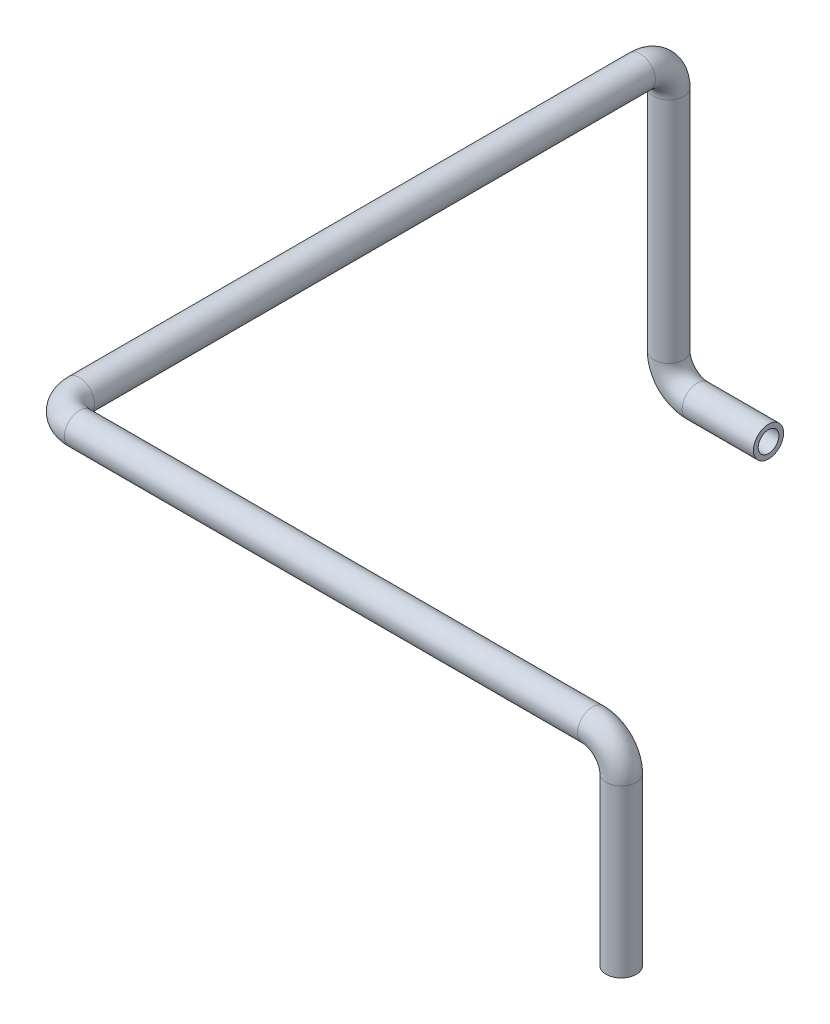
ISO-10303-21;
HEADER;
FILE_DESCRIPTION(('STEP AP214'),'2;1');
FILE_NAME('part.step','',(''),(''),'','','');
FILE_SCHEMA(('AUTOMOTIVE_DESIGN { 1 0 10303 214 1 1 1 1 }'));
ENDSEC;
DATA;
#1=APPLICATION_CONTEXT('core data for automotive mechanical design processes');
#2=APPLICATION_PROTOCOL_DEFINITION('international standard','automotive_design',2000,#1);
#3=PRODUCT_CONTEXT('',#1,'mechanical');
#4=PRODUCT('Part','Part','',(#3));
#5=PRODUCT_RELATED_PRODUCT_CATEGORY('part','',(#4));
#6=PRODUCT_DEFINITION_FORMATION('','',#4);
#7=PRODUCT_DEFINITION_CONTEXT('part definition',#1,'design');
#8=PRODUCT_DEFINITION('design','',#6,#7);
#9=PRODUCT_DEFINITION_SHAPE('','',#8);
#10=(LENGTH_UNIT() NAMED_UNIT(*) SI_UNIT(.MILLI.,.METRE.));
#11=(NAMED_UNIT(*) PLANE_ANGLE_UNIT() SI_UNIT($,.RADIAN.));
#12=(NAMED_UNIT(*) SI_UNIT($,.STERADIAN.) SOLID_ANGLE_UNIT());
#13=UNCERTAINTY_MEASURE_WITH_UNIT(LENGTH_MEASURE(1.E-05),#10,'distance_accuracy_value','');
#14=(GEOMETRIC_REPRESENTATION_CONTEXT(3) GLOBAL_UNCERTAINTY_ASSIGNED_CONTEXT((#13)) GLOBAL_UNIT_ASSIGNED_CONTEXT((#10,
#11,#12)) REPRESENTATION_CONTEXT('',''));
#15=CARTESIAN_POINT('',(0.,0.,0.));
#16=DIRECTION('',(0.,0.,1.));
#17=DIRECTION('',(1.,0.,0.));
#18=AXIS2_PLACEMENT_3D('',#15,#16,#17);
#19=CARTESIAN_POINT('',(-149.,290.,50.));
#20=DIRECTION('',(1.,0.,0.));
#21=DIRECTION('',(0.,-1.,0.));
#22=AXIS2_PLACEMENT_3D('',#19,#20,#21);
#23=PLANE('',#22);
#24=CARTESIAN_POINT('',(-149.,290.,50.));
#25=DIRECTION('',(1.,0.,0.));
#26=DIRECTION('',(0.,-1.,0.));
#27=AXIS2_PLACEMENT_3D('',#24,#25,#26);
#28=CIRCLE('',#27,2.175);
#29=CARTESIAN_POINT('',(-149.,287.825,50.));
#30=VERTEX_POINT('',#29);
#31=EDGE_CURVE('E311',#30,#30,#28,.T.);
#32=ORIENTED_EDGE('',*,*,#31,.F.);
#33=EDGE_LOOP('',(#32));
#34=FACE_BOUND('',#33,.T.);
#35=CARTESIAN_POINT('',(-149.,290.,50.));
#36=DIRECTION('',(1.,0.,0.));
#37=DIRECTION('',(0.,0.,-1.));
#38=AXIS2_PLACEMENT_3D('',#35,#36,#37);
#39=CIRCLE('',#38,3.175);
#40=CARTESIAN_POINT('',(-149.,290.,46.825));
#41=VERTEX_POINT('',#40);
#42=EDGE_CURVE('E75',#41,#41,#39,.T.);
#43=ORIENTED_EDGE('',*,*,#42,.T.);
#44=EDGE_LOOP('',(#43));
#45=FACE_BOUND('',#44,.T.);
#46=ADVANCED_FACE('F52',(#34,#45),#23,.T.);
#47=CARTESIAN_POINT('',(-50.,309.,180.));
#48=DIRECTION('',(0.,1.,0.));
#49=DIRECTION('',(0.,0.,1.));
#50=AXIS2_PLACEMENT_3D('',#47,#48,#49);
#51=PLANE('',#50);
#52=CARTESIAN_POINT('',(-50.,309.,180.));
#53=DIRECTION('',(0.,1.,0.));
#54=DIRECTION('',(0.,0.,1.));
#55=AXIS2_PLACEMENT_3D('',#52,#53,#54);
#56=CIRCLE('',#55,2.175);
#57=CARTESIAN_POINT('',(-50.,309.,182.175));
#58=VERTEX_POINT('',#57);
#59=EDGE_CURVE('E73',#58,#58,#56,.T.);
#60=ORIENTED_EDGE('',*,*,#59,.T.);
#61=EDGE_LOOP('',(#60));
#62=FACE_BOUND('',#61,.T.);
#63=CARTESIAN_POINT('',(-50.,309.,180.));
#64=DIRECTION('',(0.,1.,0.));
#65=DIRECTION('',(0.,0.,1.));
#66=AXIS2_PLACEMENT_3D('',#63,#64,#65);
#67=CIRCLE('',#66,3.175);
#68=CARTESIAN_POINT('',(-50.,309.,183.175));
#69=VERTEX_POINT('',#68);
#70=EDGE_CURVE('E11',#69,#69,#67,.T.);
#71=ORIENTED_EDGE('',*,*,#70,.F.);
#72=EDGE_LOOP('',(#71));
#73=FACE_BOUND('',#72,.T.);
#74=ADVANCED_FACE('F162',(#62,#73),#51,.F.);
#75=CARTESIAN_POINT('',(-149.,290.,50.));
#76=DIRECTION('',(-1.,0.,0.));
#77=DIRECTION('',(0.,0.,1.));
#78=AXIS2_PLACEMENT_3D('',#75,#76,#77);
#79=CYLINDRICAL_SURFACE('',#78,3.175);
#80=CARTESIAN_POINT('',(-164.,290.,50.));
#81=DIRECTION('',(-1.,0.,0.));
#82=DIRECTION('',(0.,0.,1.));
#83=AXIS2_PLACEMENT_3D('',#80,#81,#82);
#84=CIRCLE('',#83,3.175);
#85=CARTESIAN_POINT('',(-164.,286.825,50.));
#86=VERTEX_POINT('',#85);
#87=EDGE_CURVE('E74',#86,#86,#84,.F.);
#88=ORIENTED_EDGE('',*,*,#87,.T.);
#89=EDGE_LOOP('',(#88));
#90=FACE_BOUND('',#89,.T.);
#91=ORIENTED_EDGE('',*,*,#42,.F.);
#92=EDGE_LOOP('',(#91));
#93=FACE_BOUND('',#92,.T.);
#94=ADVANCED_FACE('F167',(#90,#93),#79,.T.);
#95=CARTESIAN_POINT('',(-164.,296.,50.));
#96=DIRECTION('',(0.,0.,-1.));
#97=DIRECTION('',(-1.,0.,0.));
#98=AXIS2_PLACEMENT_3D('',#95,#96,#97);
#99=TOROIDAL_SURFACE('',#98,5.99999999999995,3.175);
#100=CARTESIAN_POINT('',(-170.,296.,50.));
#101=DIRECTION('',(0.,-1.,0.));
#102=DIRECTION('',(1.,0.,0.));
#103=AXIS2_PLACEMENT_3D('',#100,#101,#102);
#104=CIRCLE('',#103,3.175);
#105=CARTESIAN_POINT('',(-173.175,296.,50.));
#106=VERTEX_POINT('',#105);
#107=EDGE_CURVE('E78',#106,#106,#104,.T.);
#108=CARTESIAN_POINT('',(-164.,296.,50.));
#109=DIRECTION('',(0.,0.,-1.));
#110=DIRECTION('',(-1.,0.,0.));
#111=AXIS2_PLACEMENT_3D('',#108,#109,#110);
#112=CIRCLE('',#111,9.17499999999995);
#113=EDGE_CURVE('',#86,#106,#112,.T.);
#114=ORIENTED_EDGE('',*,*,#87,.F.);
#115=ORIENTED_EDGE('',*,*,#107,.T.);
#116=ORIENTED_EDGE('',*,*,#113,.T.);
#117=ORIENTED_EDGE('',*,*,#113,.F.);
#118=EDGE_LOOP('',(#114,#116,#115,#117));
#119=FACE_BOUND('',#118,.T.);
#120=ADVANCED_FACE('F171',(#119),#99,.T.);
#121=CARTESIAN_POINT('',(-170.,296.,50.));
#122=DIRECTION('',(0.,1.,0.));
#123=DIRECTION('',(0.,0.,1.));
#124=AXIS2_PLACEMENT_3D('',#121,#122,#123);
#125=CYLINDRICAL_SURFACE('',#124,3.175);
#126=CARTESIAN_POINT('',(-170.,344.,50.));
#127=DIRECTION('',(0.,1.,0.));
#128=DIRECTION('',(0.,0.,1.));
#129=AXIS2_PLACEMENT_3D('',#126,#127,#128);
#130=CIRCLE('',#129,3.175);
#131=CARTESIAN_POINT('',(-170.,344.,46.825));
#132=VERTEX_POINT('',#131);
#133=EDGE_CURVE('E91',#132,#132,#130,.F.);
#134=ORIENTED_EDGE('',*,*,#133,.T.);
#135=EDGE_LOOP('',(#134));
#136=FACE_BOUND('',#135,.T.);
#137=ORIENTED_EDGE('',*,*,#107,.F.);
#138=EDGE_LOOP('',(#137));
#139=FACE_BOUND('',#138,.T.);
#140=ADVANCED_FACE('F176',(#136,#139),#125,.T.);
#141=CARTESIAN_POINT('',(-170.,344.,56.));
#142=DIRECTION('',(1.,0.,0.));
#143=DIRECTION('',(0.,0.,-1.));
#144=AXIS2_PLACEMENT_3D('',#141,#142,#143);
#145=TOROIDAL_SURFACE('',#144,6.,3.175);
#146=CARTESIAN_POINT('',(-170.,350.,56.));
#147=DIRECTION('',(0.,0.,-1.));
#148=DIRECTION('',(0.,1.,0.));
#149=AXIS2_PLACEMENT_3D('',#146,#147,#148);
#150=CIRCLE('',#149,3.175);
#151=CARTESIAN_POINT('',(-170.,353.175,56.));
#152=VERTEX_POINT('',#151);
#153=EDGE_CURVE('E96',#152,#152,#150,.T.);
#154=CARTESIAN_POINT('',(-170.,344.,56.));
#155=DIRECTION('',(1.,0.,0.));
#156=DIRECTION('',(0.,0.,-1.));
#157=AXIS2_PLACEMENT_3D('',#154,#155,#156);
#158=CIRCLE('',#157,9.175);
#159=EDGE_CURVE('',#132,#152,#158,.T.);
#160=ORIENTED_EDGE('',*,*,#133,.F.);
#161=ORIENTED_EDGE('',*,*,#153,.T.);
#162=ORIENTED_EDGE('',*,*,#159,.T.);
#163=ORIENTED_EDGE('',*,*,#159,.F.);
#164=EDGE_LOOP('',(#160,#162,#161,#163));
#165=FACE_BOUND('',#164,.T.);
#166=ADVANCED_FACE('F179',(#165),#145,.T.);
#167=CARTESIAN_POINT('',(-170.,350.,56.));
#168=DIRECTION('',(0.,0.,1.));
#169=DIRECTION('',(1.,0.,0.));
#170=AXIS2_PLACEMENT_3D('',#167,#168,#169);
#171=CYLINDRICAL_SURFACE('',#170,3.175);
#172=CARTESIAN_POINT('',(-170.,350.,174.));
#173=DIRECTION('',(0.,0.,1.));
#174=DIRECTION('',(1.,0.,0.));
#175=AXIS2_PLACEMENT_3D('',#172,#173,#174);
#176=CIRCLE('',#175,3.175);
#177=CARTESIAN_POINT('',(-173.175,350.,174.));
#178=VERTEX_POINT('',#177);
#179=EDGE_CURVE('E97',#178,#178,#176,.F.);
#180=ORIENTED_EDGE('',*,*,#179,.T.);
#181=EDGE_LOOP('',(#180));
#182=FACE_BOUND('',#181,.T.);
#183=ORIENTED_EDGE('',*,*,#153,.F.);
#184=EDGE_LOOP('',(#183));
#185=FACE_BOUND('',#184,.T.);
#186=ADVANCED_FACE('F119',(#182,#185),#171,.T.);
#187=CARTESIAN_POINT('',(-164.,350.,174.));
#188=DIRECTION('',(0.,1.,0.));
#189=DIRECTION('',(0.,0.,1.));
#190=AXIS2_PLACEMENT_3D('',#187,#188,#189);
#191=TOROIDAL_SURFACE('',#190,6.00000000000001,3.175);
#192=CARTESIAN_POINT('',(-164.,350.,180.));
#193=DIRECTION('',(-1.,0.,0.));
#194=DIRECTION('',(0.,0.,1.));
#195=AXIS2_PLACEMENT_3D('',#192,#193,#194);
#196=CIRCLE('',#195,3.175);
#197=CARTESIAN_POINT('',(-164.,350.,183.175));
#198=VERTEX_POINT('',#197);
#199=EDGE_CURVE('E68',#198,#198,#196,.T.);
#200=CARTESIAN_POINT('',(-164.,350.,174.));
#201=DIRECTION('',(0.,1.,0.));
#202=DIRECTION('',(0.,0.,1.));
#203=AXIS2_PLACEMENT_3D('',#200,#201,#202);
#204=CIRCLE('',#203,9.175);
#205=EDGE_CURVE('',#178,#198,#204,.T.);
#206=ORIENTED_EDGE('',*,*,#179,.F.);
#207=ORIENTED_EDGE('',*,*,#199,.T.);
#208=ORIENTED_EDGE('',*,*,#205,.T.);
#209=ORIENTED_EDGE('',*,*,#205,.F.);
#210=EDGE_LOOP('',(#206,#208,#207,#209));
#211=FACE_BOUND('',#210,.T.);
#212=ADVANCED_FACE('F102',(#211),#191,.T.);
#213=CARTESIAN_POINT('',(-164.,350.,180.));
#214=DIRECTION('',(1.,0.,0.));
#215=DIRECTION('',(0.,0.,-1.));
#216=AXIS2_PLACEMENT_3D('',#213,#214,#215);
#217=CYLINDRICAL_SURFACE('',#216,3.175);
#218=CARTESIAN_POINT('',(-56.,350.,180.));
#219=DIRECTION('',(1.,0.,0.));
#220=DIRECTION('',(0.,0.,-1.));
#221=AXIS2_PLACEMENT_3D('',#218,#219,#220);
#222=CIRCLE('',#221,3.175);
#223=CARTESIAN_POINT('',(-56.,353.175,180.));
#224=VERTEX_POINT('',#223);
#225=EDGE_CURVE('E63',#224,#224,#222,.F.);
#226=ORIENTED_EDGE('',*,*,#225,.T.);
#227=EDGE_LOOP('',(#226));
#228=FACE_BOUND('',#227,.T.);
#229=ORIENTED_EDGE('',*,*,#199,.F.);
#230=EDGE_LOOP('',(#229));
#231=FACE_BOUND('',#230,.T.);
#232=ADVANCED_FACE('F110',(#228,#231),#217,.T.);
#233=CARTESIAN_POINT('',(-56.,344.,180.));
#234=DIRECTION('',(0.,0.,-1.));
#235=DIRECTION('',(-1.,0.,0.));
#236=AXIS2_PLACEMENT_3D('',#233,#234,#235);
#237=TOROIDAL_SURFACE('',#236,6.00000000000001,3.175);
#238=CARTESIAN_POINT('',(-50.,344.000000000001,180.));
#239=DIRECTION('',(0.,1.,0.));
#240=DIRECTION('',(-1.,0.,0.));
#241=AXIS2_PLACEMENT_3D('',#238,#239,#240);
#242=CIRCLE('',#241,3.175);
#243=CARTESIAN_POINT('',(-46.825,344.000000000001,180.));
#244=VERTEX_POINT('',#243);
#245=EDGE_CURVE('E58',#244,#244,#242,.T.);
#246=CARTESIAN_POINT('',(-56.,344.,180.));
#247=DIRECTION('',(0.,0.,-1.));
#248=DIRECTION('',(-1.,0.,0.));
#249=AXIS2_PLACEMENT_3D('',#246,#247,#248);
#250=CIRCLE('',#249,9.175);
#251=EDGE_CURVE('',#224,#244,#250,.T.);
#252=ORIENTED_EDGE('',*,*,#225,.F.);
#253=ORIENTED_EDGE('',*,*,#245,.T.);
#254=ORIENTED_EDGE('',*,*,#251,.T.);
#255=ORIENTED_EDGE('',*,*,#251,.F.);
#256=EDGE_LOOP('',(#252,#254,#253,#255));
#257=FACE_BOUND('',#256,.T.);
#258=ADVANCED_FACE('F108',(#257),#237,.T.);
#259=CARTESIAN_POINT('',(-50.,344.,180.));
#260=DIRECTION('',(0.,-1.,0.));
#261=DIRECTION('',(0.,0.,-1.));
#262=AXIS2_PLACEMENT_3D('',#259,#260,#261);
#263=CYLINDRICAL_SURFACE('',#262,3.175);
#264=ORIENTED_EDGE('',*,*,#70,.T.);
#265=EDGE_LOOP('',(#264));
#266=FACE_BOUND('',#265,.T.);
#267=ORIENTED_EDGE('',*,*,#245,.F.);
#268=EDGE_LOOP('',(#267));
#269=FACE_BOUND('',#268,.T.);
#270=ADVANCED_FACE('F54',(#266,#269),#263,.T.);
#271=CARTESIAN_POINT('',(-149.,290.,50.));
#272=DIRECTION('',(-1.,0.,0.));
#273=DIRECTION('',(0.,0.,1.));
#274=AXIS2_PLACEMENT_3D('',#271,#272,#273);
#275=CYLINDRICAL_SURFACE('',#274,2.175);
#276=CARTESIAN_POINT('',(-164.,290.,50.));
#277=DIRECTION('',(1.,0.,0.));
#278=DIRECTION('',(0.,-1.,0.));
#279=AXIS2_PLACEMENT_3D('',#276,#277,#278);
#280=CIRCLE('',#279,2.175);
#281=CARTESIAN_POINT('',(-164.,287.825,50.));
#282=VERTEX_POINT('',#281);
#283=EDGE_CURVE('E314',#282,#282,#280,.T.);
#284=ORIENTED_EDGE('',*,*,#283,.F.);
#285=EDGE_LOOP('',(#284));
#286=FACE_BOUND('',#285,.T.);
#287=ORIENTED_EDGE('',*,*,#31,.T.);
#288=EDGE_LOOP('',(#287));
#289=FACE_BOUND('',#288,.T.);
#290=ADVANCED_FACE('F118',(#286,#289),#275,.F.);
#291=CARTESIAN_POINT('',(-164.,296.,50.));
#292=DIRECTION('',(0.,0.,-1.));
#293=DIRECTION('',(-1.,0.,0.));
#294=AXIS2_PLACEMENT_3D('',#291,#292,#293);
#295=TOROIDAL_SURFACE('',#294,5.99999999999995,2.175);
#296=CARTESIAN_POINT('',(-170.,296.,50.));
#297=DIRECTION('',(0.,-1.,0.));
#298=DIRECTION('',(-1.,0.,0.));
#299=AXIS2_PLACEMENT_3D('',#296,#297,#298);
#300=CIRCLE('',#299,2.175);
#301=CARTESIAN_POINT('',(-172.175,296.,50.));
#302=VERTEX_POINT('',#301);
#303=EDGE_CURVE('E320',#302,#302,#300,.T.);
#304=CARTESIAN_POINT('',(-164.,296.,50.));
#305=DIRECTION('',(0.,0.,-1.));
#306=DIRECTION('',(-1.,0.,0.));
#307=AXIS2_PLACEMENT_3D('',#304,#305,#306);
#308=CIRCLE('',#307,8.17499999999995);
#309=EDGE_CURVE('',#282,#302,#308,.T.);
#310=ORIENTED_EDGE('',*,*,#283,.T.);
#311=ORIENTED_EDGE('',*,*,#303,.F.);
#312=ORIENTED_EDGE('',*,*,#309,.T.);
#313=ORIENTED_EDGE('',*,*,#309,.F.);
#314=EDGE_LOOP('',(#310,#312,#311,#313));
#315=FACE_BOUND('',#314,.T.);
#316=ADVANCED_FACE('F122',(#315),#295,.F.);
#317=CARTESIAN_POINT('',(-170.,296.,50.));
#318=DIRECTION('',(0.,1.,0.));
#319=DIRECTION('',(0.,0.,1.));
#320=AXIS2_PLACEMENT_3D('',#317,#318,#319);
#321=CYLINDRICAL_SURFACE('',#320,2.175);
#322=CARTESIAN_POINT('',(-170.,344.,50.));
#323=DIRECTION('',(0.,-1.,0.));
#324=DIRECTION('',(-1.,0.,0.));
#325=AXIS2_PLACEMENT_3D('',#322,#323,#324);
#326=CIRCLE('',#325,2.175);
#327=CARTESIAN_POINT('',(-170.,344.,47.825));
#328=VERTEX_POINT('',#327);
#329=EDGE_CURVE('E325',#328,#328,#326,.T.);
#330=ORIENTED_EDGE('',*,*,#329,.F.);
#331=EDGE_LOOP('',(#330));
#332=FACE_BOUND('',#331,.T.);
#333=ORIENTED_EDGE('',*,*,#303,.T.);
#334=EDGE_LOOP('',(#333));
#335=FACE_BOUND('',#334,.T.);
#336=ADVANCED_FACE('F128',(#332,#335),#321,.F.);
#337=CARTESIAN_POINT('',(-170.,344.,56.));
#338=DIRECTION('',(1.,0.,0.));
#339=DIRECTION('',(0.,0.,-1.));
#340=AXIS2_PLACEMENT_3D('',#337,#338,#339);
#341=TOROIDAL_SURFACE('',#340,6.,2.175);
#342=CARTESIAN_POINT('',(-170.,350.,56.));
#343=DIRECTION('',(0.,0.,-1.));
#344=DIRECTION('',(-1.,0.,0.));
#345=AXIS2_PLACEMENT_3D('',#342,#343,#344);
#346=CIRCLE('',#345,2.175);
#347=CARTESIAN_POINT('',(-170.,352.175,56.));
#348=VERTEX_POINT('',#347);
#349=EDGE_CURVE('E324',#348,#348,#346,.T.);
#350=CARTESIAN_POINT('',(-170.,344.,56.));
#351=DIRECTION('',(1.,0.,0.));
#352=DIRECTION('',(0.,0.,-1.));
#353=AXIS2_PLACEMENT_3D('',#350,#351,#352);
#354=CIRCLE('',#353,8.175);
#355=EDGE_CURVE('',#328,#348,#354,.T.);
#356=ORIENTED_EDGE('',*,*,#329,.T.);
#357=ORIENTED_EDGE('',*,*,#349,.F.);
#358=ORIENTED_EDGE('',*,*,#355,.T.);
#359=ORIENTED_EDGE('',*,*,#355,.F.);
#360=EDGE_LOOP('',(#356,#358,#357,#359));
#361=FACE_BOUND('',#360,.T.);
#362=ADVANCED_FACE('F137',(#361),#341,.F.);
#363=CARTESIAN_POINT('',(-170.,350.,56.));
#364=DIRECTION('',(0.,0.,1.));
#365=DIRECTION('',(1.,0.,0.));
#366=AXIS2_PLACEMENT_3D('',#363,#364,#365);
#367=CYLINDRICAL_SURFACE('',#366,2.175);
#368=CARTESIAN_POINT('',(-170.,350.,174.));
#369=DIRECTION('',(0.,0.,-1.));
#370=DIRECTION('',(-1.,0.,0.));
#371=AXIS2_PLACEMENT_3D('',#368,#369,#370);
#372=CIRCLE('',#371,2.175);
#373=CARTESIAN_POINT('',(-172.175,350.,174.));
#374=VERTEX_POINT('',#373);
#375=EDGE_CURVE('E327',#374,#374,#372,.T.);
#376=ORIENTED_EDGE('',*,*,#375,.F.);
#377=EDGE_LOOP('',(#376));
#378=FACE_BOUND('',#377,.T.);
#379=ORIENTED_EDGE('',*,*,#349,.T.);
#380=EDGE_LOOP('',(#379));
#381=FACE_BOUND('',#380,.T.);
#382=ADVANCED_FACE('F142',(#378,#381),#367,.F.);
#383=CARTESIAN_POINT('',(-164.,350.,174.));
#384=DIRECTION('',(0.,1.,0.));
#385=DIRECTION('',(0.,0.,1.));
#386=AXIS2_PLACEMENT_3D('',#383,#384,#385);
#387=TOROIDAL_SURFACE('',#386,6.00000000000001,2.175);
#388=CARTESIAN_POINT('',(-164.,350.,180.));
#389=DIRECTION('',(-1.,0.,0.));
#390=DIRECTION('',(0.,0.,1.));
#391=AXIS2_PLACEMENT_3D('',#388,#389,#390);
#392=CIRCLE('',#391,2.175);
#393=CARTESIAN_POINT('',(-164.,350.,182.175));
#394=VERTEX_POINT('',#393);
#395=EDGE_CURVE('E332',#394,#394,#392,.T.);
#396=CARTESIAN_POINT('',(-164.,350.,174.));
#397=DIRECTION('',(0.,1.,0.));
#398=DIRECTION('',(0.,0.,1.));
#399=AXIS2_PLACEMENT_3D('',#396,#397,#398);
#400=CIRCLE('',#399,8.175);
#401=EDGE_CURVE('',#374,#394,#400,.T.);
#402=ORIENTED_EDGE('',*,*,#375,.T.);
#403=ORIENTED_EDGE('',*,*,#395,.F.);
#404=ORIENTED_EDGE('',*,*,#401,.T.);
#405=ORIENTED_EDGE('',*,*,#401,.F.);
#406=EDGE_LOOP('',(#402,#404,#403,#405));
#407=FACE_BOUND('',#406,.T.);
#408=ADVANCED_FACE('F148',(#407),#387,.F.);
#409=CARTESIAN_POINT('',(-164.,350.,180.));
#410=DIRECTION('',(1.,0.,0.));
#411=DIRECTION('',(0.,0.,-1.));
#412=AXIS2_PLACEMENT_3D('',#409,#410,#411);
#413=CYLINDRICAL_SURFACE('',#412,2.175);
#414=CARTESIAN_POINT('',(-56.,350.,180.));
#415=DIRECTION('',(-1.,0.,0.));
#416=DIRECTION('',(0.,0.,1.));
#417=AXIS2_PLACEMENT_3D('',#414,#415,#416);
#418=CIRCLE('',#417,2.175);
#419=CARTESIAN_POINT('',(-56.,352.175,180.));
#420=VERTEX_POINT('',#419);
#421=EDGE_CURVE('E87',#420,#420,#418,.T.);
#422=ORIENTED_EDGE('',*,*,#421,.F.);
#423=EDGE_LOOP('',(#422));
#424=FACE_BOUND('',#423,.T.);
#425=ORIENTED_EDGE('',*,*,#395,.T.);
#426=EDGE_LOOP('',(#425));
#427=FACE_BOUND('',#426,.T.);
#428=ADVANCED_FACE('F147',(#424,#427),#413,.F.);
#429=CARTESIAN_POINT('',(-56.,344.,180.));
#430=DIRECTION('',(0.,0.,-1.));
#431=DIRECTION('',(-1.,0.,0.));
#432=AXIS2_PLACEMENT_3D('',#429,#430,#431);
#433=TOROIDAL_SURFACE('',#432,6.00000000000001,2.175);
#434=CARTESIAN_POINT('',(-49.9999999999971,344.000000000001,180.));
#435=DIRECTION('',(0.,1.,0.));
#436=DIRECTION('',(0.,0.,1.));
#437=AXIS2_PLACEMENT_3D('',#434,#435,#436);
#438=CIRCLE('',#437,2.175);
#439=CARTESIAN_POINT('',(-47.825,344.000000000001,180.));
#440=VERTEX_POINT('',#439);
#441=EDGE_CURVE('E85',#440,#440,#438,.T.);
#442=CARTESIAN_POINT('',(-56.,344.,180.));
#443=DIRECTION('',(0.,0.,-1.));
#444=DIRECTION('',(-1.,0.,0.));
#445=AXIS2_PLACEMENT_3D('',#442,#443,#444);
#446=CIRCLE('',#445,8.175);
#447=EDGE_CURVE('',#420,#440,#446,.T.);
#448=ORIENTED_EDGE('',*,*,#421,.T.);
#449=ORIENTED_EDGE('',*,*,#441,.F.);
#450=ORIENTED_EDGE('',*,*,#447,.T.);
#451=ORIENTED_EDGE('',*,*,#447,.F.);
#452=EDGE_LOOP('',(#448,#450,#449,#451));
#453=FACE_BOUND('',#452,.T.);
#454=ADVANCED_FACE('F152',(#453),#433,.F.);
#455=CARTESIAN_POINT('',(-50.,344.,180.));
#456=DIRECTION('',(0.,-1.,0.));
#457=DIRECTION('',(0.,0.,-1.));
#458=AXIS2_PLACEMENT_3D('',#455,#456,#457);
#459=CYLINDRICAL_SURFACE('',#458,2.175);
#460=ORIENTED_EDGE('',*,*,#59,.F.);
#461=EDGE_LOOP('',(#460));
#462=FACE_BOUND('',#461,.T.);
#463=ORIENTED_EDGE('',*,*,#441,.T.);
#464=EDGE_LOOP('',(#463));
#465=FACE_BOUND('',#464,.T.);
#466=ADVANCED_FACE('F158',(#462,#465),#459,.F.);
#467=CLOSED_SHELL('',(#46,#74,#94,#120,#140,#166,#186,#212,#232,#258,#270,#290,#316,#336,#362,
#382,#408,#428,#454,#466));
#468=MANIFOLD_SOLID_BREP('B2',#467);
#469=ADVANCED_BREP_SHAPE_REPRESENTATION('',(#18,#468),#14);
#470=SHAPE_DEFINITION_REPRESENTATION(#9,#469);
ENDSEC;
END-ISO-10303-21;
